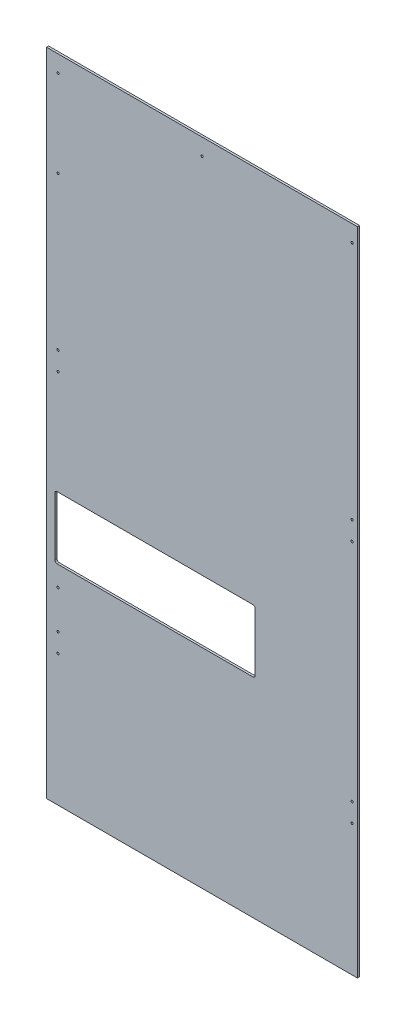
ISO-10303-21;
HEADER;
FILE_DESCRIPTION(('STEP AP214'),'2;1');
FILE_NAME('part.step','',(''),(''),'','','');
FILE_SCHEMA(('AUTOMOTIVE_DESIGN { 1 0 10303 214 1 1 1 1 }'));
ENDSEC;
DATA;
#1=APPLICATION_CONTEXT('core data for automotive mechanical design processes');
#2=APPLICATION_PROTOCOL_DEFINITION('international standard','automotive_design',2000,#1);
#3=PRODUCT_CONTEXT('',#1,'mechanical');
#4=PRODUCT('Part','Part','',(#3));
#5=PRODUCT_RELATED_PRODUCT_CATEGORY('part','',(#4));
#6=PRODUCT_DEFINITION_FORMATION('','',#4);
#7=PRODUCT_DEFINITION_CONTEXT('part definition',#1,'design');
#8=PRODUCT_DEFINITION('design','',#6,#7);
#9=PRODUCT_DEFINITION_SHAPE('','',#8);
#10=(LENGTH_UNIT() NAMED_UNIT(*) SI_UNIT(.MILLI.,.METRE.));
#11=(NAMED_UNIT(*) PLANE_ANGLE_UNIT() SI_UNIT($,.RADIAN.));
#12=(NAMED_UNIT(*) SI_UNIT($,.STERADIAN.) SOLID_ANGLE_UNIT());
#13=UNCERTAINTY_MEASURE_WITH_UNIT(LENGTH_MEASURE(1.E-05),#10,'distance_accuracy_value','');
#14=(GEOMETRIC_REPRESENTATION_CONTEXT(3) GLOBAL_UNCERTAINTY_ASSIGNED_CONTEXT((#13)) GLOBAL_UNIT_ASSIGNED_CONTEXT((#10,
#11,#12)) REPRESENTATION_CONTEXT('',''));
#15=CARTESIAN_POINT('',(0.,0.,0.));
#16=DIRECTION('',(0.,0.,1.));
#17=DIRECTION('',(1.,0.,0.));
#18=AXIS2_PLACEMENT_3D('',#15,#16,#17);
#19=CARTESIAN_POINT('',(0.,0.,0.));
#20=DIRECTION('',(0.,0.,1.));
#21=DIRECTION('',(1.,0.,0.));
#22=AXIS2_PLACEMENT_3D('',#19,#20,#21);
#23=PLANE('',#22);
#24=DIRECTION('',(0.,1.,0.));
#25=VECTOR('',#24,1.);
#26=CARTESIAN_POINT('',(161.925,-355.6,0.));
#27=LINE('',#26,#25);
#28=CARTESIAN_POINT('',(161.925,-349.25,0.));
#29=VERTEX_POINT('',#28);
#30=CARTESIAN_POINT('',(161.925,-171.45,0.));
#31=VERTEX_POINT('',#30);
#32=EDGE_CURVE('E138',#29,#31,#27,.T.);
#33=ORIENTED_EDGE('',*,*,#32,.T.);
#34=CARTESIAN_POINT('',(155.575,-171.45,0.));
#35=DIRECTION('',(0.,0.,-1.));
#36=DIRECTION('',(-1.,0.,0.));
#37=AXIS2_PLACEMENT_3D('',#34,#35,#36);
#38=CIRCLE('',#37,6.35);
#39=CARTESIAN_POINT('',(155.575,-165.1,0.));
#40=VERTEX_POINT('',#39);
#41=EDGE_CURVE('E141',#31,#40,#38,.F.);
#42=ORIENTED_EDGE('',*,*,#41,.T.);
#43=DIRECTION('',(1.,0.,0.));
#44=VECTOR('',#43,1.);
#45=CARTESIAN_POINT('',(161.925,-165.1,0.));
#46=LINE('',#45,#44);
#47=CARTESIAN_POINT('',(-441.325,-165.1,0.));
#48=VERTEX_POINT('',#47);
#49=EDGE_CURVE('E142',#40,#48,#46,.F.);
#50=ORIENTED_EDGE('',*,*,#49,.T.);
#51=CARTESIAN_POINT('',(-441.325,-171.45,0.));
#52=DIRECTION('',(0.,0.,-1.));
#53=DIRECTION('',(-1.,0.,0.));
#54=AXIS2_PLACEMENT_3D('',#51,#52,#53);
#55=CIRCLE('',#54,6.35);
#56=CARTESIAN_POINT('',(-447.675,-171.45,0.));
#57=VERTEX_POINT('',#56);
#58=EDGE_CURVE('E83',#48,#57,#55,.F.);
#59=ORIENTED_EDGE('',*,*,#58,.T.);
#60=DIRECTION('',(0.,1.,0.));
#61=VECTOR('',#60,1.);
#62=CARTESIAN_POINT('',(-447.675,-165.1,0.));
#63=LINE('',#62,#61);
#64=CARTESIAN_POINT('',(-447.675,-349.25,0.));
#65=VERTEX_POINT('',#64);
#66=EDGE_CURVE('E131',#57,#65,#63,.F.);
#67=ORIENTED_EDGE('',*,*,#66,.T.);
#68=CARTESIAN_POINT('',(-441.325,-349.25,0.));
#69=DIRECTION('',(0.,0.,-1.));
#70=DIRECTION('',(-1.,0.,0.));
#71=AXIS2_PLACEMENT_3D('',#68,#69,#70);
#72=CIRCLE('',#71,6.35);
#73=CARTESIAN_POINT('',(-441.325,-355.6,0.));
#74=VERTEX_POINT('',#73);
#75=EDGE_CURVE('E200',#65,#74,#72,.F.);
#76=ORIENTED_EDGE('',*,*,#75,.T.);
#77=DIRECTION('',(1.,0.,0.));
#78=VECTOR('',#77,1.);
#79=CARTESIAN_POINT('',(-447.675,-355.6,0.));
#80=LINE('',#79,#78);
#81=CARTESIAN_POINT('',(155.575,-355.6,0.));
#82=VERTEX_POINT('',#81);
#83=EDGE_CURVE('E134',#74,#82,#80,.T.);
#84=ORIENTED_EDGE('',*,*,#83,.T.);
#85=CARTESIAN_POINT('',(155.575,-349.25,0.));
#86=DIRECTION('',(0.,0.,-1.));
#87=DIRECTION('',(-1.,0.,0.));
#88=AXIS2_PLACEMENT_3D('',#85,#86,#87);
#89=CIRCLE('',#88,6.35);
#90=EDGE_CURVE('E137',#82,#29,#89,.F.);
#91=ORIENTED_EDGE('',*,*,#90,.T.);
#92=EDGE_LOOP('',(#33,#42,#50,#59,#67,#76,#84,#91));
#93=FACE_BOUND('',#92,.T.);
#94=CARTESIAN_POINT('',(-438.15,-416.42056960449,0.));
#95=DIRECTION('',(0.,0.,1.));
#96=DIRECTION('',(1.,0.,0.));
#97=AXIS2_PLACEMENT_3D('',#94,#95,#96);
#98=CIRCLE('',#97,3.3655);
#99=CARTESIAN_POINT('',(-434.7845,-416.42056960449,0.));
#100=VERTEX_POINT('',#99);
#101=EDGE_CURVE('E210',#100,#100,#98,.T.);
#102=ORIENTED_EDGE('',*,*,#101,.T.);
#103=EDGE_LOOP('',(#102));
#104=FACE_BOUND('',#103,.T.);
#105=CARTESIAN_POINT('',(-438.15,675.764851893806,0.));
#106=DIRECTION('',(0.,0.,1.));
#107=DIRECTION('',(1.,0.,0.));
#108=AXIS2_PLACEMENT_3D('',#105,#106,#107);
#109=CIRCLE('',#108,3.3655);
#110=CARTESIAN_POINT('',(-434.7845,675.764851893806,0.));
#111=VERTEX_POINT('',#110);
#112=EDGE_CURVE('E213',#111,#111,#109,.T.);
#113=ORIENTED_EDGE('',*,*,#112,.T.);
#114=EDGE_LOOP('',(#113));
#115=FACE_BOUND('',#114,.T.);
#116=CARTESIAN_POINT('',(457.2,-533.4,0.));
#117=DIRECTION('',(0.,0.,1.));
#118=DIRECTION('',(1.,0.,0.));
#119=AXIS2_PLACEMENT_3D('',#116,#117,#118);
#120=CIRCLE('',#119,3.3655);
#121=CARTESIAN_POINT('',(460.5655,-533.4,0.));
#122=VERTEX_POINT('',#121);
#123=EDGE_CURVE('E216',#122,#122,#120,.T.);
#124=ORIENTED_EDGE('',*,*,#123,.T.);
#125=EDGE_LOOP('',(#124));
#126=FACE_BOUND('',#125,.T.);
#127=CARTESIAN_POINT('',(457.2,-590.55,0.));
#128=DIRECTION('',(0.,0.,1.));
#129=DIRECTION('',(1.,0.,0.));
#130=AXIS2_PLACEMENT_3D('',#127,#128,#129);
#131=CIRCLE('',#130,3.3655);
#132=CARTESIAN_POINT('',(460.5655,-590.55,0.));
#133=VERTEX_POINT('',#132);
#134=EDGE_CURVE('E219',#133,#133,#131,.T.);
#135=ORIENTED_EDGE('',*,*,#134,.T.);
#136=EDGE_LOOP('',(#135));
#137=FACE_BOUND('',#136,.T.);
#138=CARTESIAN_POINT('',(-438.15,-590.55,0.));
#139=DIRECTION('',(0.,0.,1.));
#140=DIRECTION('',(1.,0.,0.));
#141=AXIS2_PLACEMENT_3D('',#138,#139,#140);
#142=CIRCLE('',#141,3.3655);
#143=CARTESIAN_POINT('',(-434.7845,-590.55,0.));
#144=VERTEX_POINT('',#143);
#145=EDGE_CURVE('E222',#144,#144,#142,.T.);
#146=ORIENTED_EDGE('',*,*,#145,.T.);
#147=EDGE_LOOP('',(#146));
#148=FACE_BOUND('',#147,.T.);
#149=CARTESIAN_POINT('',(-438.15,-533.4,0.));
#150=DIRECTION('',(0.,0.,1.));
#151=DIRECTION('',(1.,0.,0.));
#152=AXIS2_PLACEMENT_3D('',#149,#150,#151);
#153=CIRCLE('',#152,3.3655);
#154=CARTESIAN_POINT('',(-434.7845,-533.4,0.));
#155=VERTEX_POINT('',#154);
#156=EDGE_CURVE('E225',#155,#155,#153,.T.);
#157=ORIENTED_EDGE('',*,*,#156,.T.);
#158=EDGE_LOOP('',(#157));
#159=FACE_BOUND('',#158,.T.);
#160=CARTESIAN_POINT('',(0.,939.8,0.));
#161=DIRECTION('',(0.,0.,1.));
#162=DIRECTION('',(1.,0.,0.));
#163=AXIS2_PLACEMENT_3D('',#160,#161,#162);
#164=CIRCLE('',#163,3.3655);
#165=CARTESIAN_POINT('',(3.3655,939.8,0.));
#166=VERTEX_POINT('',#165);
#167=EDGE_CURVE('E228',#166,#166,#164,.T.);
#168=ORIENTED_EDGE('',*,*,#167,.T.);
#169=EDGE_LOOP('',(#168));
#170=FACE_BOUND('',#169,.T.);
#171=CARTESIAN_POINT('',(-438.15,939.8,0.));
#172=DIRECTION('',(0.,0.,1.));
#173=DIRECTION('',(1.,0.,0.));
#174=AXIS2_PLACEMENT_3D('',#171,#172,#173);
#175=CIRCLE('',#174,3.3655);
#176=CARTESIAN_POINT('',(-434.7845,939.8,0.));
#177=VERTEX_POINT('',#176);
#178=EDGE_CURVE('E231',#177,#177,#175,.T.);
#179=ORIENTED_EDGE('',*,*,#178,.T.);
#180=EDGE_LOOP('',(#179));
#181=FACE_BOUND('',#180,.T.);
#182=CARTESIAN_POINT('',(457.2,939.8,0.));
#183=DIRECTION('',(0.,0.,1.));
#184=DIRECTION('',(1.,0.,0.));
#185=AXIS2_PLACEMENT_3D('',#182,#183,#184);
#186=CIRCLE('',#185,3.3655);
#187=CARTESIAN_POINT('',(460.5655,939.8,0.));
#188=VERTEX_POINT('',#187);
#189=EDGE_CURVE('E234',#188,#188,#186,.T.);
#190=ORIENTED_EDGE('',*,*,#189,.T.);
#191=EDGE_LOOP('',(#190));
#192=FACE_BOUND('',#191,.T.);
#193=CARTESIAN_POINT('',(457.2,209.55,0.));
#194=DIRECTION('',(0.,0.,1.));
#195=DIRECTION('',(1.,0.,0.));
#196=AXIS2_PLACEMENT_3D('',#193,#194,#195);
#197=CIRCLE('',#196,3.3655);
#198=CARTESIAN_POINT('',(460.5655,209.55,0.));
#199=VERTEX_POINT('',#198);
#200=EDGE_CURVE('E237',#199,#199,#197,.T.);
#201=ORIENTED_EDGE('',*,*,#200,.T.);
#202=EDGE_LOOP('',(#201));
#203=FACE_BOUND('',#202,.T.);
#204=CARTESIAN_POINT('',(457.2,152.4,0.));
#205=DIRECTION('',(0.,0.,1.));
#206=DIRECTION('',(1.,0.,0.));
#207=AXIS2_PLACEMENT_3D('',#204,#205,#206);
#208=CIRCLE('',#207,3.3655);
#209=CARTESIAN_POINT('',(460.5655,152.4,0.));
#210=VERTEX_POINT('',#209);
#211=EDGE_CURVE('E240',#210,#210,#208,.T.);
#212=ORIENTED_EDGE('',*,*,#211,.T.);
#213=EDGE_LOOP('',(#212));
#214=FACE_BOUND('',#213,.T.);
#215=CARTESIAN_POINT('',(-438.15,152.4,0.));
#216=DIRECTION('',(0.,0.,1.));
#217=DIRECTION('',(1.,0.,0.));
#218=AXIS2_PLACEMENT_3D('',#215,#216,#217);
#219=CIRCLE('',#218,3.3655);
#220=CARTESIAN_POINT('',(-434.7845,152.4,0.));
#221=VERTEX_POINT('',#220);
#222=EDGE_CURVE('E242',#221,#221,#219,.T.);
#223=ORIENTED_EDGE('',*,*,#222,.T.);
#224=EDGE_LOOP('',(#223));
#225=FACE_BOUND('',#224,.T.);
#226=CARTESIAN_POINT('',(-438.15,209.55,0.));
#227=DIRECTION('',(0.,0.,1.));
#228=DIRECTION('',(1.,0.,0.));
#229=AXIS2_PLACEMENT_3D('',#226,#227,#228);
#230=CIRCLE('',#229,3.3655);
#231=CARTESIAN_POINT('',(-434.7845,209.55,0.));
#232=VERTEX_POINT('',#231);
#233=EDGE_CURVE('E19',#232,#232,#230,.T.);
#234=ORIENTED_EDGE('',*,*,#233,.T.);
#235=EDGE_LOOP('',(#234));
#236=FACE_BOUND('',#235,.T.);
#237=DIRECTION('',(0.,1.,0.));
#238=VECTOR('',#237,1.);
#239=CARTESIAN_POINT('',(473.075,-990.6,0.));
#240=LINE('',#239,#238);
#241=CARTESIAN_POINT('',(473.075,-990.6,0.));
#242=VERTEX_POINT('',#241);
#243=CARTESIAN_POINT('',(473.075,990.6,0.));
#244=VERTEX_POINT('',#243);
#245=EDGE_CURVE('E119',#242,#244,#240,.T.);
#246=ORIENTED_EDGE('',*,*,#245,.F.);
#247=DIRECTION('',(1.,0.,0.));
#248=VECTOR('',#247,1.);
#249=CARTESIAN_POINT('',(-473.075,-990.6,0.));
#250=LINE('',#249,#248);
#251=CARTESIAN_POINT('',(-473.075,-990.6,0.));
#252=VERTEX_POINT('',#251);
#253=EDGE_CURVE('E107',#252,#242,#250,.T.);
#254=ORIENTED_EDGE('',*,*,#253,.F.);
#255=DIRECTION('',(0.,1.,0.));
#256=VECTOR('',#255,1.);
#257=CARTESIAN_POINT('',(-473.075,990.6,0.));
#258=LINE('',#257,#256);
#259=CARTESIAN_POINT('',(-473.075,990.6,0.));
#260=VERTEX_POINT('',#259);
#261=EDGE_CURVE('E247',#260,#252,#258,.F.);
#262=ORIENTED_EDGE('',*,*,#261,.F.);
#263=DIRECTION('',(1.,0.,0.));
#264=VECTOR('',#263,1.);
#265=CARTESIAN_POINT('',(473.075,990.6,0.));
#266=LINE('',#265,#264);
#267=EDGE_CURVE('E92',#244,#260,#266,.F.);
#268=ORIENTED_EDGE('',*,*,#267,.F.);
#269=EDGE_LOOP('',(#246,#254,#262,#268));
#270=FACE_BOUND('',#269,.T.);
#271=ADVANCED_FACE('F16',(#93,#104,#115,#126,#137,#148,#159,#170,#181,#192,#203,#214,#225,#236,
#270),#23,.F.);
#272=CARTESIAN_POINT('',(-473.075,-990.6,0.));
#273=DIRECTION('',(0.,-1.,0.));
#274=DIRECTION('',(0.,0.,-1.));
#275=AXIS2_PLACEMENT_3D('',#272,#273,#274);
#276=PLANE('',#275);
#277=DIRECTION('',(0.,0.,1.));
#278=VECTOR('',#277,1.);
#279=CARTESIAN_POINT('',(-473.075,-990.6,0.));
#280=LINE('',#279,#278);
#281=CARTESIAN_POINT('',(-473.075,-990.6,6.35));
#282=VERTEX_POINT('',#281);
#283=EDGE_CURVE('E115',#252,#282,#280,.T.);
#284=ORIENTED_EDGE('',*,*,#283,.F.);
#285=ORIENTED_EDGE('',*,*,#253,.T.);
#286=DIRECTION('',(0.,0.,-1.));
#287=VECTOR('',#286,1.);
#288=CARTESIAN_POINT('',(473.075,-990.6,0.));
#289=LINE('',#288,#287);
#290=CARTESIAN_POINT('',(473.075,-990.6,6.35));
#291=VERTEX_POINT('',#290);
#292=EDGE_CURVE('E112',#291,#242,#289,.T.);
#293=ORIENTED_EDGE('',*,*,#292,.F.);
#294=DIRECTION('',(1.,0.,0.));
#295=VECTOR('',#294,1.);
#296=CARTESIAN_POINT('',(0.,-990.6,6.35));
#297=LINE('',#296,#295);
#298=EDGE_CURVE('E266',#282,#291,#297,.T.);
#299=ORIENTED_EDGE('',*,*,#298,.F.);
#300=EDGE_LOOP('',(#284,#285,#293,#299));
#301=FACE_BOUND('',#300,.T.);
#302=ADVANCED_FACE('F109',(#301),#276,.T.);
#303=CARTESIAN_POINT('',(473.075,-990.6,0.));
#304=DIRECTION('',(1.,0.,0.));
#305=DIRECTION('',(0.,0.,-1.));
#306=AXIS2_PLACEMENT_3D('',#303,#304,#305);
#307=PLANE('',#306);
#308=ORIENTED_EDGE('',*,*,#292,.T.);
#309=ORIENTED_EDGE('',*,*,#245,.T.);
#310=DIRECTION('',(0.,0.,1.));
#311=VECTOR('',#310,1.);
#312=CARTESIAN_POINT('',(473.075,990.6,0.));
#313=LINE('',#312,#311);
#314=CARTESIAN_POINT('',(473.075,990.6,6.35));
#315=VERTEX_POINT('',#314);
#316=EDGE_CURVE('E122',#315,#244,#313,.F.);
#317=ORIENTED_EDGE('',*,*,#316,.F.);
#318=DIRECTION('',(0.,1.,0.));
#319=VECTOR('',#318,1.);
#320=CARTESIAN_POINT('',(473.075,0.,6.35));
#321=LINE('',#320,#319);
#322=EDGE_CURVE('E126',#291,#315,#321,.T.);
#323=ORIENTED_EDGE('',*,*,#322,.F.);
#324=EDGE_LOOP('',(#308,#309,#317,#323));
#325=FACE_BOUND('',#324,.T.);
#326=ADVANCED_FACE('F124',(#325),#307,.T.);
#327=CARTESIAN_POINT('',(473.075,990.6,0.));
#328=DIRECTION('',(0.,1.,0.));
#329=DIRECTION('',(0.,0.,1.));
#330=AXIS2_PLACEMENT_3D('',#327,#328,#329);
#331=PLANE('',#330);
#332=ORIENTED_EDGE('',*,*,#316,.T.);
#333=ORIENTED_EDGE('',*,*,#267,.T.);
#334=DIRECTION('',(0.,0.,1.));
#335=VECTOR('',#334,1.);
#336=CARTESIAN_POINT('',(-473.075,990.6,0.));
#337=LINE('',#336,#335);
#338=CARTESIAN_POINT('',(-473.075,990.6,6.35));
#339=VERTEX_POINT('',#338);
#340=EDGE_CURVE('E250',#339,#260,#337,.F.);
#341=ORIENTED_EDGE('',*,*,#340,.F.);
#342=DIRECTION('',(1.,0.,0.));
#343=VECTOR('',#342,1.);
#344=CARTESIAN_POINT('',(0.,990.6,6.35));
#345=LINE('',#344,#343);
#346=EDGE_CURVE('E263',#315,#339,#345,.F.);
#347=ORIENTED_EDGE('',*,*,#346,.F.);
#348=EDGE_LOOP('',(#332,#333,#341,#347));
#349=FACE_BOUND('',#348,.T.);
#350=ADVANCED_FACE('F260',(#349),#331,.T.);
#351=CARTESIAN_POINT('',(-473.075,990.6,0.));
#352=DIRECTION('',(-1.,0.,0.));
#353=DIRECTION('',(0.,0.,1.));
#354=AXIS2_PLACEMENT_3D('',#351,#352,#353);
#355=PLANE('',#354);
#356=ORIENTED_EDGE('',*,*,#340,.T.);
#357=ORIENTED_EDGE('',*,*,#261,.T.);
#358=ORIENTED_EDGE('',*,*,#283,.T.);
#359=DIRECTION('',(0.,1.,0.));
#360=VECTOR('',#359,1.);
#361=CARTESIAN_POINT('',(-473.075,0.,6.35));
#362=LINE('',#361,#360);
#363=EDGE_CURVE('E199',#339,#282,#362,.F.);
#364=ORIENTED_EDGE('',*,*,#363,.F.);
#365=EDGE_LOOP('',(#356,#357,#358,#364));
#366=FACE_BOUND('',#365,.T.);
#367=ADVANCED_FACE('F271',(#366),#355,.T.);
#368=CARTESIAN_POINT('',(-438.15,209.55,6.35));
#369=DIRECTION('',(0.,0.,1.));
#370=DIRECTION('',(1.,0.,0.));
#371=AXIS2_PLACEMENT_3D('',#368,#369,#370);
#372=CYLINDRICAL_SURFACE('',#371,3.3655);
#373=CARTESIAN_POINT('',(-438.15,209.55,6.35));
#374=DIRECTION('',(0.,0.,1.));
#375=DIRECTION('',(1.,0.,0.));
#376=AXIS2_PLACEMENT_3D('',#373,#374,#375);
#377=CIRCLE('',#376,3.3655);
#378=CARTESIAN_POINT('',(-434.7845,209.55,6.35));
#379=VERTEX_POINT('',#378);
#380=EDGE_CURVE('E196',#379,#379,#377,.F.);
#381=ORIENTED_EDGE('',*,*,#380,.F.);
#382=EDGE_LOOP('',(#381));
#383=FACE_BOUND('',#382,.T.);
#384=ORIENTED_EDGE('',*,*,#233,.F.);
#385=EDGE_LOOP('',(#384));
#386=FACE_BOUND('',#385,.T.);
#387=ADVANCED_FACE('F504',(#383,#386),#372,.F.);
#388=CARTESIAN_POINT('',(-438.15,152.4,6.35));
#389=DIRECTION('',(0.,0.,1.));
#390=DIRECTION('',(1.,0.,0.));
#391=AXIS2_PLACEMENT_3D('',#388,#389,#390);
#392=CYLINDRICAL_SURFACE('',#391,3.3655);
#393=CARTESIAN_POINT('',(-438.15,152.4,6.35));
#394=DIRECTION('',(0.,0.,1.));
#395=DIRECTION('',(1.,0.,0.));
#396=AXIS2_PLACEMENT_3D('',#393,#394,#395);
#397=CIRCLE('',#396,3.3655);
#398=CARTESIAN_POINT('',(-434.7845,152.4,6.35));
#399=VERTEX_POINT('',#398);
#400=EDGE_CURVE('E193',#399,#399,#397,.F.);
#401=ORIENTED_EDGE('',*,*,#400,.F.);
#402=EDGE_LOOP('',(#401));
#403=FACE_BOUND('',#402,.T.);
#404=ORIENTED_EDGE('',*,*,#222,.F.);
#405=EDGE_LOOP('',(#404));
#406=FACE_BOUND('',#405,.T.);
#407=ADVANCED_FACE('F495',(#403,#406),#392,.F.);
#408=CARTESIAN_POINT('',(457.2,152.4,6.35));
#409=DIRECTION('',(0.,0.,1.));
#410=DIRECTION('',(1.,0.,0.));
#411=AXIS2_PLACEMENT_3D('',#408,#409,#410);
#412=CYLINDRICAL_SURFACE('',#411,3.3655);
#413=CARTESIAN_POINT('',(457.2,152.4,6.35));
#414=DIRECTION('',(0.,0.,1.));
#415=DIRECTION('',(1.,0.,0.));
#416=AXIS2_PLACEMENT_3D('',#413,#414,#415);
#417=CIRCLE('',#416,3.3655);
#418=CARTESIAN_POINT('',(460.5655,152.4,6.35));
#419=VERTEX_POINT('',#418);
#420=EDGE_CURVE('E190',#419,#419,#417,.F.);
#421=ORIENTED_EDGE('',*,*,#420,.F.);
#422=EDGE_LOOP('',(#421));
#423=FACE_BOUND('',#422,.T.);
#424=ORIENTED_EDGE('',*,*,#211,.F.);
#425=EDGE_LOOP('',(#424));
#426=FACE_BOUND('',#425,.T.);
#427=ADVANCED_FACE('F486',(#423,#426),#412,.F.);
#428=CARTESIAN_POINT('',(457.2,209.55,6.35));
#429=DIRECTION('',(0.,0.,1.));
#430=DIRECTION('',(1.,0.,0.));
#431=AXIS2_PLACEMENT_3D('',#428,#429,#430);
#432=CYLINDRICAL_SURFACE('',#431,3.3655);
#433=CARTESIAN_POINT('',(457.2,209.55,6.35));
#434=DIRECTION('',(0.,0.,1.));
#435=DIRECTION('',(1.,0.,0.));
#436=AXIS2_PLACEMENT_3D('',#433,#434,#435);
#437=CIRCLE('',#436,3.3655);
#438=CARTESIAN_POINT('',(460.5655,209.55,6.35));
#439=VERTEX_POINT('',#438);
#440=EDGE_CURVE('E187',#439,#439,#437,.F.);
#441=ORIENTED_EDGE('',*,*,#440,.F.);
#442=EDGE_LOOP('',(#441));
#443=FACE_BOUND('',#442,.T.);
#444=ORIENTED_EDGE('',*,*,#200,.F.);
#445=EDGE_LOOP('',(#444));
#446=FACE_BOUND('',#445,.T.);
#447=ADVANCED_FACE('F477',(#443,#446),#432,.F.);
#448=CARTESIAN_POINT('',(457.2,939.8,6.35));
#449=DIRECTION('',(0.,0.,1.));
#450=DIRECTION('',(1.,0.,0.));
#451=AXIS2_PLACEMENT_3D('',#448,#449,#450);
#452=CYLINDRICAL_SURFACE('',#451,3.3655);
#453=CARTESIAN_POINT('',(457.2,939.8,6.35));
#454=DIRECTION('',(0.,0.,1.));
#455=DIRECTION('',(1.,0.,0.));
#456=AXIS2_PLACEMENT_3D('',#453,#454,#455);
#457=CIRCLE('',#456,3.3655);
#458=CARTESIAN_POINT('',(460.5655,939.8,6.35));
#459=VERTEX_POINT('',#458);
#460=EDGE_CURVE('E184',#459,#459,#457,.F.);
#461=ORIENTED_EDGE('',*,*,#460,.F.);
#462=EDGE_LOOP('',(#461));
#463=FACE_BOUND('',#462,.T.);
#464=ORIENTED_EDGE('',*,*,#189,.F.);
#465=EDGE_LOOP('',(#464));
#466=FACE_BOUND('',#465,.T.);
#467=ADVANCED_FACE('F468',(#463,#466),#452,.F.);
#468=CARTESIAN_POINT('',(-438.15,939.8,6.35));
#469=DIRECTION('',(0.,0.,1.));
#470=DIRECTION('',(1.,0.,0.));
#471=AXIS2_PLACEMENT_3D('',#468,#469,#470);
#472=CYLINDRICAL_SURFACE('',#471,3.3655);
#473=CARTESIAN_POINT('',(-438.15,939.8,6.35));
#474=DIRECTION('',(0.,0.,1.));
#475=DIRECTION('',(1.,0.,0.));
#476=AXIS2_PLACEMENT_3D('',#473,#474,#475);
#477=CIRCLE('',#476,3.3655);
#478=CARTESIAN_POINT('',(-434.7845,939.8,6.35));
#479=VERTEX_POINT('',#478);
#480=EDGE_CURVE('E181',#479,#479,#477,.F.);
#481=ORIENTED_EDGE('',*,*,#480,.F.);
#482=EDGE_LOOP('',(#481));
#483=FACE_BOUND('',#482,.T.);
#484=ORIENTED_EDGE('',*,*,#178,.F.);
#485=EDGE_LOOP('',(#484));
#486=FACE_BOUND('',#485,.T.);
#487=ADVANCED_FACE('F459',(#483,#486),#472,.F.);
#488=CARTESIAN_POINT('',(0.,939.8,6.35));
#489=DIRECTION('',(0.,0.,1.));
#490=DIRECTION('',(1.,0.,0.));
#491=AXIS2_PLACEMENT_3D('',#488,#489,#490);
#492=CYLINDRICAL_SURFACE('',#491,3.3655);
#493=CARTESIAN_POINT('',(0.,939.8,6.35));
#494=DIRECTION('',(0.,0.,1.));
#495=DIRECTION('',(1.,0.,0.));
#496=AXIS2_PLACEMENT_3D('',#493,#494,#495);
#497=CIRCLE('',#496,3.3655);
#498=CARTESIAN_POINT('',(3.3655,939.8,6.35));
#499=VERTEX_POINT('',#498);
#500=EDGE_CURVE('E178',#499,#499,#497,.F.);
#501=ORIENTED_EDGE('',*,*,#500,.F.);
#502=EDGE_LOOP('',(#501));
#503=FACE_BOUND('',#502,.T.);
#504=ORIENTED_EDGE('',*,*,#167,.F.);
#505=EDGE_LOOP('',(#504));
#506=FACE_BOUND('',#505,.T.);
#507=ADVANCED_FACE('F450',(#503,#506),#492,.F.);
#508=CARTESIAN_POINT('',(-438.15,-533.4,6.35));
#509=DIRECTION('',(0.,0.,1.));
#510=DIRECTION('',(1.,0.,0.));
#511=AXIS2_PLACEMENT_3D('',#508,#509,#510);
#512=CYLINDRICAL_SURFACE('',#511,3.3655);
#513=CARTESIAN_POINT('',(-438.15,-533.4,6.35));
#514=DIRECTION('',(0.,0.,1.));
#515=DIRECTION('',(1.,0.,0.));
#516=AXIS2_PLACEMENT_3D('',#513,#514,#515);
#517=CIRCLE('',#516,3.3655);
#518=CARTESIAN_POINT('',(-434.7845,-533.4,6.35));
#519=VERTEX_POINT('',#518);
#520=EDGE_CURVE('E175',#519,#519,#517,.F.);
#521=ORIENTED_EDGE('',*,*,#520,.F.);
#522=EDGE_LOOP('',(#521));
#523=FACE_BOUND('',#522,.T.);
#524=ORIENTED_EDGE('',*,*,#156,.F.);
#525=EDGE_LOOP('',(#524));
#526=FACE_BOUND('',#525,.T.);
#527=ADVANCED_FACE('F441',(#523,#526),#512,.F.);
#528=CARTESIAN_POINT('',(-438.15,-590.55,6.35));
#529=DIRECTION('',(0.,0.,1.));
#530=DIRECTION('',(1.,0.,0.));
#531=AXIS2_PLACEMENT_3D('',#528,#529,#530);
#532=CYLINDRICAL_SURFACE('',#531,3.3655);
#533=CARTESIAN_POINT('',(-438.15,-590.55,6.35));
#534=DIRECTION('',(0.,0.,1.));
#535=DIRECTION('',(1.,0.,0.));
#536=AXIS2_PLACEMENT_3D('',#533,#534,#535);
#537=CIRCLE('',#536,3.3655);
#538=CARTESIAN_POINT('',(-434.7845,-590.55,6.35));
#539=VERTEX_POINT('',#538);
#540=EDGE_CURVE('E172',#539,#539,#537,.F.);
#541=ORIENTED_EDGE('',*,*,#540,.F.);
#542=EDGE_LOOP('',(#541));
#543=FACE_BOUND('',#542,.T.);
#544=ORIENTED_EDGE('',*,*,#145,.F.);
#545=EDGE_LOOP('',(#544));
#546=FACE_BOUND('',#545,.T.);
#547=ADVANCED_FACE('F432',(#543,#546),#532,.F.);
#548=CARTESIAN_POINT('',(457.2,-590.55,6.35));
#549=DIRECTION('',(0.,0.,1.));
#550=DIRECTION('',(1.,0.,0.));
#551=AXIS2_PLACEMENT_3D('',#548,#549,#550);
#552=CYLINDRICAL_SURFACE('',#551,3.3655);
#553=CARTESIAN_POINT('',(457.2,-590.55,6.35));
#554=DIRECTION('',(0.,0.,1.));
#555=DIRECTION('',(1.,0.,0.));
#556=AXIS2_PLACEMENT_3D('',#553,#554,#555);
#557=CIRCLE('',#556,3.3655);
#558=CARTESIAN_POINT('',(460.5655,-590.55,6.35));
#559=VERTEX_POINT('',#558);
#560=EDGE_CURVE('E169',#559,#559,#557,.F.);
#561=ORIENTED_EDGE('',*,*,#560,.F.);
#562=EDGE_LOOP('',(#561));
#563=FACE_BOUND('',#562,.T.);
#564=ORIENTED_EDGE('',*,*,#134,.F.);
#565=EDGE_LOOP('',(#564));
#566=FACE_BOUND('',#565,.T.);
#567=ADVANCED_FACE('F423',(#563,#566),#552,.F.);
#568=CARTESIAN_POINT('',(457.2,-533.4,6.35));
#569=DIRECTION('',(0.,0.,1.));
#570=DIRECTION('',(1.,0.,0.));
#571=AXIS2_PLACEMENT_3D('',#568,#569,#570);
#572=CYLINDRICAL_SURFACE('',#571,3.3655);
#573=CARTESIAN_POINT('',(457.2,-533.4,6.35));
#574=DIRECTION('',(0.,0.,1.));
#575=DIRECTION('',(1.,0.,0.));
#576=AXIS2_PLACEMENT_3D('',#573,#574,#575);
#577=CIRCLE('',#576,3.3655);
#578=CARTESIAN_POINT('',(460.5655,-533.4,6.35));
#579=VERTEX_POINT('',#578);
#580=EDGE_CURVE('E166',#579,#579,#577,.F.);
#581=ORIENTED_EDGE('',*,*,#580,.F.);
#582=EDGE_LOOP('',(#581));
#583=FACE_BOUND('',#582,.T.);
#584=ORIENTED_EDGE('',*,*,#123,.F.);
#585=EDGE_LOOP('',(#584));
#586=FACE_BOUND('',#585,.T.);
#587=ADVANCED_FACE('F414',(#583,#586),#572,.F.);
#588=CARTESIAN_POINT('',(-438.15,675.764851893806,6.35));
#589=DIRECTION('',(0.,0.,1.));
#590=DIRECTION('',(1.,0.,0.));
#591=AXIS2_PLACEMENT_3D('',#588,#589,#590);
#592=CYLINDRICAL_SURFACE('',#591,3.3655);
#593=CARTESIAN_POINT('',(-438.15,675.764851893806,6.35));
#594=DIRECTION('',(0.,0.,1.));
#595=DIRECTION('',(1.,0.,0.));
#596=AXIS2_PLACEMENT_3D('',#593,#594,#595);
#597=CIRCLE('',#596,3.3655);
#598=CARTESIAN_POINT('',(-434.7845,675.764851893806,6.35));
#599=VERTEX_POINT('',#598);
#600=EDGE_CURVE('E163',#599,#599,#597,.F.);
#601=ORIENTED_EDGE('',*,*,#600,.F.);
#602=EDGE_LOOP('',(#601));
#603=FACE_BOUND('',#602,.T.);
#604=ORIENTED_EDGE('',*,*,#112,.F.);
#605=EDGE_LOOP('',(#604));
#606=FACE_BOUND('',#605,.T.);
#607=ADVANCED_FACE('F405',(#603,#606),#592,.F.);
#608=CARTESIAN_POINT('',(-438.15,-416.42056960449,6.35));
#609=DIRECTION('',(0.,0.,1.));
#610=DIRECTION('',(1.,0.,0.));
#611=AXIS2_PLACEMENT_3D('',#608,#609,#610);
#612=CYLINDRICAL_SURFACE('',#611,3.3655);
#613=CARTESIAN_POINT('',(-438.15,-416.42056960449,6.35));
#614=DIRECTION('',(0.,0.,1.));
#615=DIRECTION('',(1.,0.,0.));
#616=AXIS2_PLACEMENT_3D('',#613,#614,#615);
#617=CIRCLE('',#616,3.3655);
#618=CARTESIAN_POINT('',(-434.7845,-416.42056960449,6.35));
#619=VERTEX_POINT('',#618);
#620=EDGE_CURVE('E160',#619,#619,#617,.F.);
#621=ORIENTED_EDGE('',*,*,#620,.F.);
#622=EDGE_LOOP('',(#621));
#623=FACE_BOUND('',#622,.T.);
#624=ORIENTED_EDGE('',*,*,#101,.F.);
#625=EDGE_LOOP('',(#624));
#626=FACE_BOUND('',#625,.T.);
#627=ADVANCED_FACE('F397',(#623,#626),#612,.F.);
#628=CARTESIAN_POINT('',(-441.325,-171.45,14.62786));
#629=DIRECTION('',(0.,0.,-1.));
#630=DIRECTION('',(-1.,0.,0.));
#631=AXIS2_PLACEMENT_3D('',#628,#629,#630);
#632=CYLINDRICAL_SURFACE('',#631,6.35);
#633=DIRECTION('',(0.,0.,1.));
#634=VECTOR('',#633,1.);
#635=CARTESIAN_POINT('',(-441.325,-165.1,6.35));
#636=LINE('',#635,#634);
#637=CARTESIAN_POINT('',(-441.325,-165.1,6.35));
#638=VERTEX_POINT('',#637);
#639=EDGE_CURVE('E145',#48,#638,#636,.T.);
#640=ORIENTED_EDGE('',*,*,#639,.T.);
#641=CARTESIAN_POINT('',(-441.325,-171.45,6.35));
#642=DIRECTION('',(0.,0.,-1.));
#643=DIRECTION('',(-1.,0.,0.));
#644=AXIS2_PLACEMENT_3D('',#641,#642,#643);
#645=CIRCLE('',#644,6.35);
#646=CARTESIAN_POINT('',(-447.675,-171.45,6.35));
#647=VERTEX_POINT('',#646);
#648=EDGE_CURVE('E157',#647,#638,#645,.T.);
#649=ORIENTED_EDGE('',*,*,#648,.F.);
#650=DIRECTION('',(0.,0.,1.));
#651=VECTOR('',#650,1.);
#652=CARTESIAN_POINT('',(-447.675,-171.45,6.35));
#653=LINE('',#652,#651);
#654=EDGE_CURVE('E133',#647,#57,#653,.F.);
#655=ORIENTED_EDGE('',*,*,#654,.T.);
#656=ORIENTED_EDGE('',*,*,#58,.F.);
#657=EDGE_LOOP('',(#640,#649,#655,#656));
#658=FACE_BOUND('',#657,.T.);
#659=ADVANCED_FACE('F300',(#658),#632,.F.);
#660=CARTESIAN_POINT('',(161.925,-165.1,6.35));
#661=DIRECTION('',(0.,1.,0.));
#662=DIRECTION('',(0.,0.,1.));
#663=AXIS2_PLACEMENT_3D('',#660,#661,#662);
#664=PLANE('',#663);
#665=DIRECTION('',(0.,0.,-1.));
#666=VECTOR('',#665,1.);
#667=CARTESIAN_POINT('',(155.575,-165.1,14.62786));
#668=LINE('',#667,#666);
#669=CARTESIAN_POINT('',(155.575,-165.1,6.35));
#670=VERTEX_POINT('',#669);
#671=EDGE_CURVE('E144',#40,#670,#668,.F.);
#672=ORIENTED_EDGE('',*,*,#671,.T.);
#673=DIRECTION('',(1.,0.,0.));
#674=VECTOR('',#673,1.);
#675=CARTESIAN_POINT('',(0.,-165.1,6.35));
#676=LINE('',#675,#674);
#677=EDGE_CURVE('E156',#638,#670,#676,.T.);
#678=ORIENTED_EDGE('',*,*,#677,.F.);
#679=ORIENTED_EDGE('',*,*,#639,.F.);
#680=ORIENTED_EDGE('',*,*,#49,.F.);
#681=EDGE_LOOP('',(#672,#678,#679,#680));
#682=FACE_BOUND('',#681,.T.);
#683=ADVANCED_FACE('F288',(#682),#664,.F.);
#684=CARTESIAN_POINT('',(155.575,-171.45,14.62786));
#685=DIRECTION('',(0.,0.,-1.));
#686=DIRECTION('',(-1.,0.,0.));
#687=AXIS2_PLACEMENT_3D('',#684,#685,#686);
#688=CYLINDRICAL_SURFACE('',#687,6.35);
#689=DIRECTION('',(0.,0.,-1.));
#690=VECTOR('',#689,1.);
#691=CARTESIAN_POINT('',(161.925,-171.45,6.35));
#692=LINE('',#691,#690);
#693=CARTESIAN_POINT('',(161.925,-171.45,6.35));
#694=VERTEX_POINT('',#693);
#695=EDGE_CURVE('E140',#31,#694,#692,.F.);
#696=ORIENTED_EDGE('',*,*,#695,.T.);
#697=CARTESIAN_POINT('',(155.575,-171.45,6.35));
#698=DIRECTION('',(0.,0.,-1.));
#699=DIRECTION('',(-1.,0.,0.));
#700=AXIS2_PLACEMENT_3D('',#697,#698,#699);
#701=CIRCLE('',#700,6.35);
#702=EDGE_CURVE('E153',#670,#694,#701,.T.);
#703=ORIENTED_EDGE('',*,*,#702,.F.);
#704=ORIENTED_EDGE('',*,*,#671,.F.);
#705=ORIENTED_EDGE('',*,*,#41,.F.);
#706=EDGE_LOOP('',(#696,#703,#704,#705));
#707=FACE_BOUND('',#706,.T.);
#708=ADVANCED_FACE('F293',(#707),#688,.F.);
#709=CARTESIAN_POINT('',(161.925,-355.6,6.35));
#710=DIRECTION('',(1.,0.,0.));
#711=DIRECTION('',(0.,0.,-1.));
#712=AXIS2_PLACEMENT_3D('',#709,#710,#711);
#713=PLANE('',#712);
#714=ORIENTED_EDGE('',*,*,#695,.F.);
#715=ORIENTED_EDGE('',*,*,#32,.F.);
#716=DIRECTION('',(0.,0.,-1.));
#717=VECTOR('',#716,1.);
#718=CARTESIAN_POINT('',(161.925,-349.25,14.62786));
#719=LINE('',#718,#717);
#720=CARTESIAN_POINT('',(161.925,-349.25,6.35));
#721=VERTEX_POINT('',#720);
#722=EDGE_CURVE('E206',#29,#721,#719,.F.);
#723=ORIENTED_EDGE('',*,*,#722,.T.);
#724=DIRECTION('',(0.,1.,0.));
#725=VECTOR('',#724,1.);
#726=CARTESIAN_POINT('',(161.925,0.,6.35));
#727=LINE('',#726,#725);
#728=EDGE_CURVE('E152',#694,#721,#727,.F.);
#729=ORIENTED_EDGE('',*,*,#728,.F.);
#730=EDGE_LOOP('',(#714,#715,#723,#729));
#731=FACE_BOUND('',#730,.T.);
#732=ADVANCED_FACE('F319',(#731),#713,.F.);
#733=CARTESIAN_POINT('',(155.575,-349.25,14.62786));
#734=DIRECTION('',(0.,0.,-1.));
#735=DIRECTION('',(-1.,0.,0.));
#736=AXIS2_PLACEMENT_3D('',#733,#734,#735);
#737=CYLINDRICAL_SURFACE('',#736,6.35);
#738=DIRECTION('',(0.,0.,-1.));
#739=VECTOR('',#738,1.);
#740=CARTESIAN_POINT('',(155.575,-355.6,6.35));
#741=LINE('',#740,#739);
#742=CARTESIAN_POINT('',(155.575,-355.6,6.35));
#743=VERTEX_POINT('',#742);
#744=EDGE_CURVE('E136',#82,#743,#741,.F.);
#745=ORIENTED_EDGE('',*,*,#744,.T.);
#746=CARTESIAN_POINT('',(155.575,-349.25,6.35));
#747=DIRECTION('',(0.,0.,-1.));
#748=DIRECTION('',(-1.,0.,0.));
#749=AXIS2_PLACEMENT_3D('',#746,#747,#748);
#750=CIRCLE('',#749,6.35);
#751=EDGE_CURVE('E149',#721,#743,#750,.T.);
#752=ORIENTED_EDGE('',*,*,#751,.F.);
#753=ORIENTED_EDGE('',*,*,#722,.F.);
#754=ORIENTED_EDGE('',*,*,#90,.F.);
#755=EDGE_LOOP('',(#745,#752,#753,#754));
#756=FACE_BOUND('',#755,.T.);
#757=ADVANCED_FACE('F316',(#756),#737,.F.);
#758=CARTESIAN_POINT('',(-447.675,-355.6,6.35));
#759=DIRECTION('',(0.,-1.,0.));
#760=DIRECTION('',(0.,0.,-1.));
#761=AXIS2_PLACEMENT_3D('',#758,#759,#760);
#762=PLANE('',#761);
#763=ORIENTED_EDGE('',*,*,#744,.F.);
#764=ORIENTED_EDGE('',*,*,#83,.F.);
#765=DIRECTION('',(0.,0.,-1.));
#766=VECTOR('',#765,1.);
#767=CARTESIAN_POINT('',(-441.325,-355.6,14.62786));
#768=LINE('',#767,#766);
#769=CARTESIAN_POINT('',(-441.325,-355.6,6.35));
#770=VERTEX_POINT('',#769);
#771=EDGE_CURVE('E203',#74,#770,#768,.F.);
#772=ORIENTED_EDGE('',*,*,#771,.T.);
#773=DIRECTION('',(1.,0.,0.));
#774=VECTOR('',#773,1.);
#775=CARTESIAN_POINT('',(0.,-355.6,6.35));
#776=LINE('',#775,#774);
#777=EDGE_CURVE('E148',#743,#770,#776,.F.);
#778=ORIENTED_EDGE('',*,*,#777,.F.);
#779=EDGE_LOOP('',(#763,#764,#772,#778));
#780=FACE_BOUND('',#779,.T.);
#781=ADVANCED_FACE('F312',(#780),#762,.F.);
#782=CARTESIAN_POINT('',(-441.325,-349.25,14.62786));
#783=DIRECTION('',(0.,0.,-1.));
#784=DIRECTION('',(-1.,0.,0.));
#785=AXIS2_PLACEMENT_3D('',#782,#783,#784);
#786=CYLINDRICAL_SURFACE('',#785,6.35);
#787=DIRECTION('',(0.,0.,1.));
#788=VECTOR('',#787,1.);
#789=CARTESIAN_POINT('',(-447.675,-349.25,6.35));
#790=LINE('',#789,#788);
#791=CARTESIAN_POINT('',(-447.675,-349.25,6.35));
#792=VERTEX_POINT('',#791);
#793=EDGE_CURVE('E34',#65,#792,#790,.T.);
#794=ORIENTED_EDGE('',*,*,#793,.T.);
#795=CARTESIAN_POINT('',(-441.325,-349.25,6.35));
#796=DIRECTION('',(0.,0.,-1.));
#797=DIRECTION('',(-1.,0.,0.));
#798=AXIS2_PLACEMENT_3D('',#795,#796,#797);
#799=CIRCLE('',#798,6.35);
#800=EDGE_CURVE('E25',#770,#792,#799,.T.);
#801=ORIENTED_EDGE('',*,*,#800,.F.);
#802=ORIENTED_EDGE('',*,*,#771,.F.);
#803=ORIENTED_EDGE('',*,*,#75,.F.);
#804=EDGE_LOOP('',(#794,#801,#802,#803));
#805=FACE_BOUND('',#804,.T.);
#806=ADVANCED_FACE('F307',(#805),#786,.F.);
#807=CARTESIAN_POINT('',(-447.675,-165.1,6.35));
#808=DIRECTION('',(-1.,0.,0.));
#809=DIRECTION('',(0.,0.,1.));
#810=AXIS2_PLACEMENT_3D('',#807,#808,#809);
#811=PLANE('',#810);
#812=ORIENTED_EDGE('',*,*,#793,.F.);
#813=ORIENTED_EDGE('',*,*,#66,.F.);
#814=ORIENTED_EDGE('',*,*,#654,.F.);
#815=DIRECTION('',(0.,1.,0.));
#816=VECTOR('',#815,1.);
#817=CARTESIAN_POINT('',(-447.675,0.,6.35));
#818=LINE('',#817,#816);
#819=EDGE_CURVE('E11',#792,#647,#818,.T.);
#820=ORIENTED_EDGE('',*,*,#819,.F.);
#821=EDGE_LOOP('',(#812,#813,#814,#820));
#822=FACE_BOUND('',#821,.T.);
#823=ADVANCED_FACE('F303',(#822),#811,.F.);
#824=CARTESIAN_POINT('',(0.,0.,6.35));
#825=DIRECTION('',(0.,0.,1.));
#826=DIRECTION('',(1.,0.,0.));
#827=AXIS2_PLACEMENT_3D('',#824,#825,#826);
#828=PLANE('',#827);
#829=ORIENTED_EDGE('',*,*,#800,.T.);
#830=ORIENTED_EDGE('',*,*,#819,.T.);
#831=ORIENTED_EDGE('',*,*,#648,.T.);
#832=ORIENTED_EDGE('',*,*,#677,.T.);
#833=ORIENTED_EDGE('',*,*,#702,.T.);
#834=ORIENTED_EDGE('',*,*,#728,.T.);
#835=ORIENTED_EDGE('',*,*,#751,.T.);
#836=ORIENTED_EDGE('',*,*,#777,.T.);
#837=EDGE_LOOP('',(#829,#830,#831,#832,#833,#834,#835,#836));
#838=FACE_BOUND('',#837,.T.);
#839=ORIENTED_EDGE('',*,*,#620,.T.);
#840=EDGE_LOOP('',(#839));
#841=FACE_BOUND('',#840,.T.);
#842=ORIENTED_EDGE('',*,*,#600,.T.);
#843=EDGE_LOOP('',(#842));
#844=FACE_BOUND('',#843,.T.);
#845=ORIENTED_EDGE('',*,*,#580,.T.);
#846=EDGE_LOOP('',(#845));
#847=FACE_BOUND('',#846,.T.);
#848=ORIENTED_EDGE('',*,*,#560,.T.);
#849=EDGE_LOOP('',(#848));
#850=FACE_BOUND('',#849,.T.);
#851=ORIENTED_EDGE('',*,*,#540,.T.);
#852=EDGE_LOOP('',(#851));
#853=FACE_BOUND('',#852,.T.);
#854=ORIENTED_EDGE('',*,*,#520,.T.);
#855=EDGE_LOOP('',(#854));
#856=FACE_BOUND('',#855,.T.);
#857=ORIENTED_EDGE('',*,*,#500,.T.);
#858=EDGE_LOOP('',(#857));
#859=FACE_BOUND('',#858,.T.);
#860=ORIENTED_EDGE('',*,*,#480,.T.);
#861=EDGE_LOOP('',(#860));
#862=FACE_BOUND('',#861,.T.);
#863=ORIENTED_EDGE('',*,*,#460,.T.);
#864=EDGE_LOOP('',(#863));
#865=FACE_BOUND('',#864,.T.);
#866=ORIENTED_EDGE('',*,*,#440,.T.);
#867=EDGE_LOOP('',(#866));
#868=FACE_BOUND('',#867,.T.);
#869=ORIENTED_EDGE('',*,*,#420,.T.);
#870=EDGE_LOOP('',(#869));
#871=FACE_BOUND('',#870,.T.);
#872=ORIENTED_EDGE('',*,*,#400,.T.);
#873=EDGE_LOOP('',(#872));
#874=FACE_BOUND('',#873,.T.);
#875=ORIENTED_EDGE('',*,*,#380,.T.);
#876=EDGE_LOOP('',(#875));
#877=FACE_BOUND('',#876,.T.);
#878=ORIENTED_EDGE('',*,*,#346,.T.);
#879=ORIENTED_EDGE('',*,*,#363,.T.);
#880=ORIENTED_EDGE('',*,*,#298,.T.);
#881=ORIENTED_EDGE('',*,*,#322,.T.);
#882=EDGE_LOOP('',(#878,#879,#880,#881));
#883=FACE_BOUND('',#882,.T.);
#884=ADVANCED_FACE('F272',(#838,#841,#844,#847,#850,#853,#856,#859,#862,#865,#868,#871,#874,
#877,#883),#828,.T.);
#885=CLOSED_SHELL('',(#271,#302,#326,#350,#367,#387,#407,#427,#447,#467,#487,#507,#527,#547,
#567,#587,#607,#627,#659,#683,#708,#732,#757,#781,#806,#823,#884));
#886=MANIFOLD_SOLID_BREP('B1',#885);
#887=ADVANCED_BREP_SHAPE_REPRESENTATION('',(#18,#886),#14);
#888=SHAPE_DEFINITION_REPRESENTATION(#9,#887);
ENDSEC;
END-ISO-10303-21;
